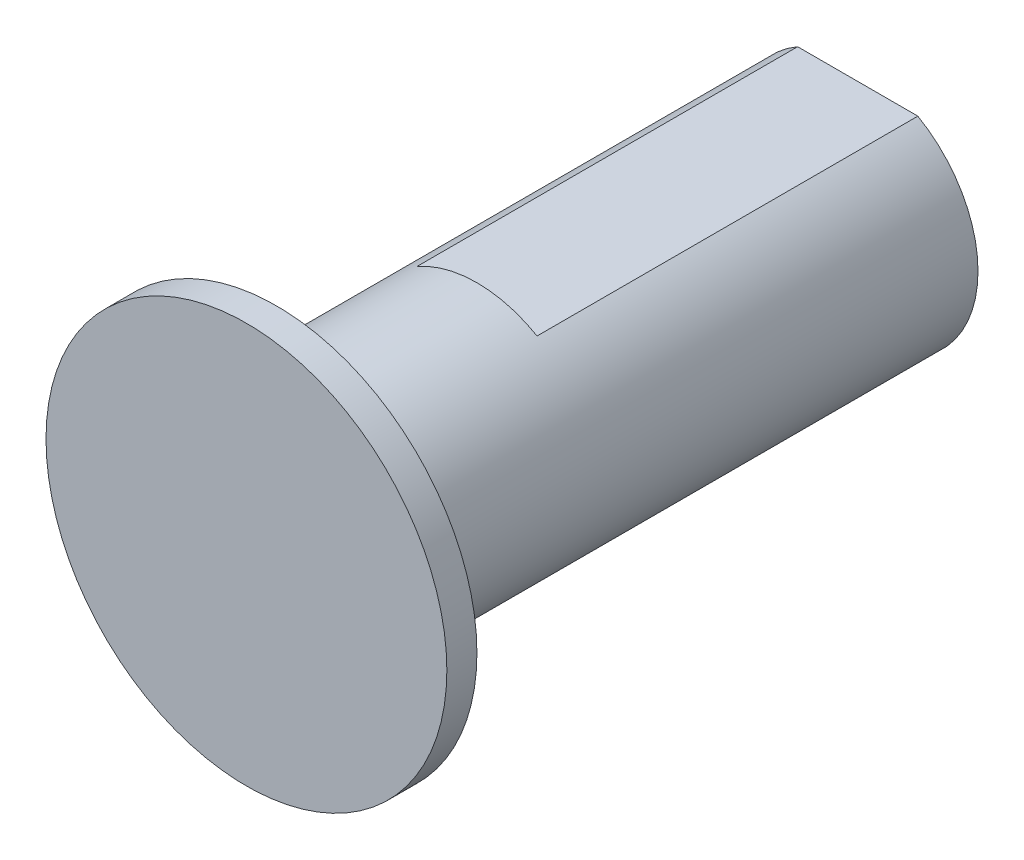
ISO-10303-21;
HEADER;
FILE_DESCRIPTION(('STEP AP214'),'2;1');
FILE_NAME('part.step','',(''),(''),'','','');
FILE_SCHEMA(('AUTOMOTIVE_DESIGN { 1 0 10303 214 1 1 1 1 }'));
ENDSEC;
DATA;
#1=APPLICATION_CONTEXT('core data for automotive mechanical design processes');
#2=APPLICATION_PROTOCOL_DEFINITION('international standard','automotive_design',2000,#1);
#3=PRODUCT_CONTEXT('',#1,'mechanical');
#4=PRODUCT('Part','Part','',(#3));
#5=PRODUCT_RELATED_PRODUCT_CATEGORY('part','',(#4));
#6=PRODUCT_DEFINITION_FORMATION('','',#4);
#7=PRODUCT_DEFINITION_CONTEXT('part definition',#1,'design');
#8=PRODUCT_DEFINITION('design','',#6,#7);
#9=PRODUCT_DEFINITION_SHAPE('','',#8);
#10=(LENGTH_UNIT() NAMED_UNIT(*) SI_UNIT(.MILLI.,.METRE.));
#11=(NAMED_UNIT(*) PLANE_ANGLE_UNIT() SI_UNIT($,.RADIAN.));
#12=(NAMED_UNIT(*) SI_UNIT($,.STERADIAN.) SOLID_ANGLE_UNIT());
#13=UNCERTAINTY_MEASURE_WITH_UNIT(LENGTH_MEASURE(1.E-05),#10,'distance_accuracy_value','');
#14=(GEOMETRIC_REPRESENTATION_CONTEXT(3) GLOBAL_UNCERTAINTY_ASSIGNED_CONTEXT((#13)) GLOBAL_UNIT_ASSIGNED_CONTEXT((#10,
#11,#12)) REPRESENTATION_CONTEXT('',''));
#15=CARTESIAN_POINT('',(0.,0.,0.));
#16=DIRECTION('',(0.,0.,1.));
#17=DIRECTION('',(1.,0.,0.));
#18=AXIS2_PLACEMENT_3D('',#15,#16,#17);
#19=CARTESIAN_POINT('',(0.,0.,29.));
#20=DIRECTION('',(0.,0.,-1.));
#21=DIRECTION('',(-1.,0.,0.));
#22=AXIS2_PLACEMENT_3D('',#19,#20,#21);
#23=CYLINDRICAL_SURFACE('',#22,6.);
#24=CARTESIAN_POINT('',(0.,0.,29.));
#25=DIRECTION('',(0.,0.,1.));
#26=DIRECTION('',(1.,0.,0.));
#27=AXIS2_PLACEMENT_3D('',#24,#25,#26);
#28=CIRCLE('',#27,6.);
#29=CARTESIAN_POINT('',(6.,0.,29.));
#30=VERTEX_POINT('',#29);
#31=EDGE_CURVE('E11',#30,#30,#28,.T.);
#32=ORIENTED_EDGE('',*,*,#31,.F.);
#33=EDGE_LOOP('',(#32));
#34=FACE_BOUND('',#33,.T.);
#35=CARTESIAN_POINT('',(0.,0.,19.));
#36=DIRECTION('',(0.,0.,-1.));
#37=DIRECTION('',(-1.,0.,0.));
#38=AXIS2_PLACEMENT_3D('',#35,#36,#37);
#39=CIRCLE('',#38,6.);
#40=CARTESIAN_POINT('',(-3.,5.19615242270663,19.));
#41=VERTEX_POINT('',#40);
#42=CARTESIAN_POINT('',(3.,5.19615242270663,19.));
#43=VERTEX_POINT('',#42);
#44=EDGE_CURVE('E77',#41,#43,#39,.T.);
#45=ORIENTED_EDGE('',*,*,#44,.F.);
#46=DIRECTION('',(0.,0.,-1.));
#47=VECTOR('',#46,1.);
#48=CARTESIAN_POINT('',(-3.,5.19615242270663,19.));
#49=LINE('',#48,#47);
#50=CARTESIAN_POINT('',(-3.,5.19615242270663,0.));
#51=VERTEX_POINT('',#50);
#52=EDGE_CURVE('E66',#41,#51,#49,.T.);
#53=ORIENTED_EDGE('',*,*,#52,.T.);
#54=CARTESIAN_POINT('',(0.,0.,0.));
#55=DIRECTION('',(0.,0.,1.));
#56=DIRECTION('',(1.,0.,0.));
#57=AXIS2_PLACEMENT_3D('',#54,#55,#56);
#58=CIRCLE('',#57,6.);
#59=CARTESIAN_POINT('',(3.,5.19615242270663,0.));
#60=VERTEX_POINT('',#59);
#61=EDGE_CURVE('E48',#51,#60,#58,.T.);
#62=ORIENTED_EDGE('',*,*,#61,.T.);
#63=DIRECTION('',(0.,0.,-1.));
#64=VECTOR('',#63,1.);
#65=CARTESIAN_POINT('',(3.,5.19615242270663,19.));
#66=LINE('',#65,#64);
#67=EDGE_CURVE('E60',#43,#60,#66,.T.);
#68=ORIENTED_EDGE('',*,*,#67,.F.);
#69=EDGE_LOOP('',(#45,#53,#62,#68));
#70=FACE_BOUND('',#69,.T.);
#71=ADVANCED_FACE('F45',(#34,#70),#23,.T.);
#72=CARTESIAN_POINT('',(0.,0.,0.));
#73=DIRECTION('',(0.,0.,1.));
#74=DIRECTION('',(1.,0.,0.));
#75=AXIS2_PLACEMENT_3D('',#72,#73,#74);
#76=PLANE('',#75);
#77=ORIENTED_EDGE('',*,*,#61,.F.);
#78=DIRECTION('',(-1.,0.,0.));
#79=VECTOR('',#78,1.);
#80=CARTESIAN_POINT('',(0.,5.19615242270663,0.));
#81=LINE('',#80,#79);
#82=EDGE_CURVE('E71',#60,#51,#81,.T.);
#83=ORIENTED_EDGE('',*,*,#82,.F.);
#84=EDGE_LOOP('',(#77,#83));
#85=FACE_BOUND('',#84,.T.);
#86=ADVANCED_FACE('F84',(#85),#76,.F.);
#87=CARTESIAN_POINT('',(0.,5.19615242270663,19.));
#88=DIRECTION('',(0.,-1.,0.));
#89=DIRECTION('',(0.,0.,-1.));
#90=AXIS2_PLACEMENT_3D('',#87,#88,#89);
#91=PLANE('',#90);
#92=ORIENTED_EDGE('',*,*,#82,.T.);
#93=ORIENTED_EDGE('',*,*,#52,.F.);
#94=DIRECTION('',(-1.,0.,0.));
#95=VECTOR('',#94,1.);
#96=CARTESIAN_POINT('',(0.,5.19615242270663,19.));
#97=LINE('',#96,#95);
#98=EDGE_CURVE('E88',#43,#41,#97,.T.);
#99=ORIENTED_EDGE('',*,*,#98,.F.);
#100=ORIENTED_EDGE('',*,*,#67,.T.);
#101=EDGE_LOOP('',(#92,#93,#99,#100));
#102=FACE_BOUND('',#101,.T.);
#103=ADVANCED_FACE('F72',(#102),#91,.F.);
#104=CARTESIAN_POINT('',(0.,0.,19.));
#105=DIRECTION('',(0.,0.,-1.));
#106=DIRECTION('',(-1.,0.,0.));
#107=AXIS2_PLACEMENT_3D('',#104,#105,#106);
#108=PLANE('',#107);
#109=ORIENTED_EDGE('',*,*,#44,.T.);
#110=ORIENTED_EDGE('',*,*,#98,.T.);
#111=EDGE_LOOP('',(#109,#110));
#112=FACE_BOUND('',#111,.T.);
#113=ADVANCED_FACE('F124',(#112),#108,.T.);
#114=CARTESIAN_POINT('',(0.,0.,30.5));
#115=DIRECTION('',(0.,0.,-1.));
#116=DIRECTION('',(-1.,0.,0.));
#117=AXIS2_PLACEMENT_3D('',#114,#115,#116);
#118=CYLINDRICAL_SURFACE('',#117,10.);
#119=CARTESIAN_POINT('',(0.,0.,30.5));
#120=DIRECTION('',(0.,0.,1.));
#121=DIRECTION('',(1.,0.,0.));
#122=AXIS2_PLACEMENT_3D('',#119,#120,#121);
#123=CIRCLE('',#122,10.);
#124=CARTESIAN_POINT('',(10.,0.,30.5));
#125=VERTEX_POINT('',#124);
#126=EDGE_CURVE('E78',#125,#125,#123,.T.);
#127=ORIENTED_EDGE('',*,*,#126,.F.);
#128=EDGE_LOOP('',(#127));
#129=FACE_BOUND('',#128,.T.);
#130=CARTESIAN_POINT('',(0.,0.,29.));
#131=DIRECTION('',(0.,0.,1.));
#132=DIRECTION('',(1.,0.,0.));
#133=AXIS2_PLACEMENT_3D('',#130,#131,#132);
#134=CIRCLE('',#133,10.);
#135=CARTESIAN_POINT('',(10.,0.,29.));
#136=VERTEX_POINT('',#135);
#137=EDGE_CURVE('E96',#136,#136,#134,.T.);
#138=ORIENTED_EDGE('',*,*,#137,.T.);
#139=EDGE_LOOP('',(#138));
#140=FACE_BOUND('',#139,.T.);
#141=ADVANCED_FACE('F102',(#129,#140),#118,.T.);
#142=CARTESIAN_POINT('',(0.,0.,30.5));
#143=DIRECTION('',(0.,0.,1.));
#144=DIRECTION('',(1.,0.,0.));
#145=AXIS2_PLACEMENT_3D('',#142,#143,#144);
#146=PLANE('',#145);
#147=ORIENTED_EDGE('',*,*,#126,.T.);
#148=EDGE_LOOP('',(#147));
#149=FACE_BOUND('',#148,.T.);
#150=ADVANCED_FACE('F106',(#149),#146,.T.);
#151=CARTESIAN_POINT('',(0.,0.,29.));
#152=DIRECTION('',(0.,0.,1.));
#153=DIRECTION('',(1.,0.,0.));
#154=AXIS2_PLACEMENT_3D('',#151,#152,#153);
#155=PLANE('',#154);
#156=ORIENTED_EDGE('',*,*,#31,.T.);
#157=EDGE_LOOP('',(#156));
#158=FACE_BOUND('',#157,.T.);
#159=ORIENTED_EDGE('',*,*,#137,.F.);
#160=EDGE_LOOP('',(#159));
#161=FACE_BOUND('',#160,.T.);
#162=ADVANCED_FACE('F104',(#158,#161),#155,.F.);
#163=CLOSED_SHELL('',(#71,#86,#103,#113,#141,#150,#162));
#164=MANIFOLD_SOLID_BREP('B2',#163);
#165=ADVANCED_BREP_SHAPE_REPRESENTATION('',(#18,#164),#14);
#166=SHAPE_DEFINITION_REPRESENTATION(#9,#165);
ENDSEC;
END-ISO-10303-21;
